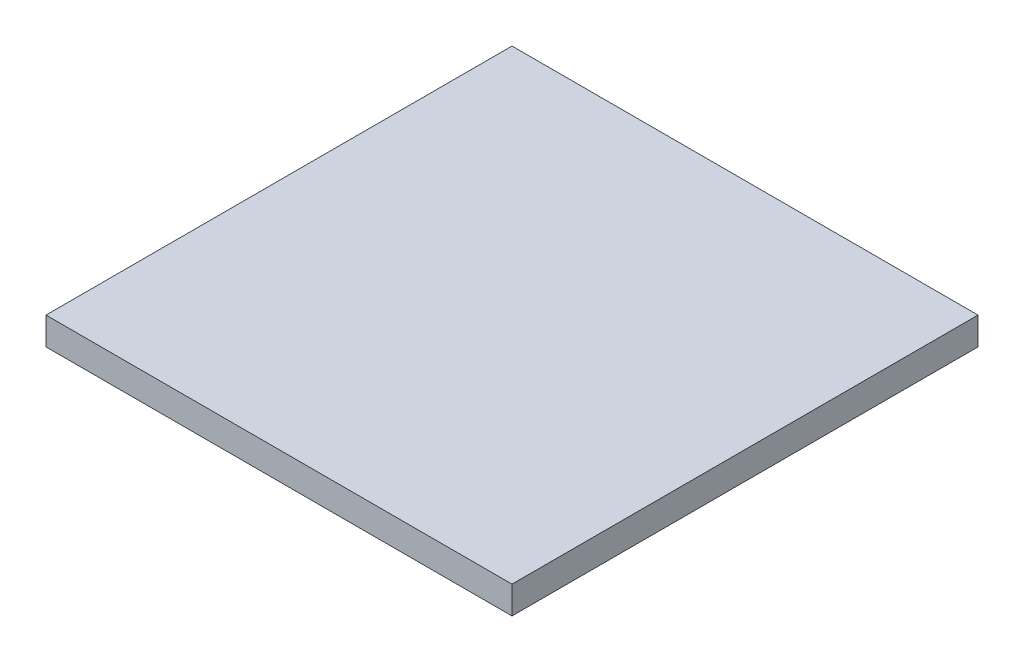
ISO-10303-21;
HEADER;
FILE_DESCRIPTION(('STEP AP214'),'2;1');
FILE_NAME('part.step','',(''),(''),'','','');
FILE_SCHEMA(('AUTOMOTIVE_DESIGN { 1 0 10303 214 1 1 1 1 }'));
ENDSEC;
DATA;
#1=APPLICATION_CONTEXT('core data for automotive mechanical design processes');
#2=APPLICATION_PROTOCOL_DEFINITION('international standard','automotive_design',2000,#1);
#3=PRODUCT_CONTEXT('',#1,'mechanical');
#4=PRODUCT('Part','Part','',(#3));
#5=PRODUCT_RELATED_PRODUCT_CATEGORY('part','',(#4));
#6=PRODUCT_DEFINITION_FORMATION('','',#4);
#7=PRODUCT_DEFINITION_CONTEXT('part definition',#1,'design');
#8=PRODUCT_DEFINITION('design','',#6,#7);
#9=PRODUCT_DEFINITION_SHAPE('','',#8);
#10=(LENGTH_UNIT() NAMED_UNIT(*) SI_UNIT(.MILLI.,.METRE.));
#11=(NAMED_UNIT(*) PLANE_ANGLE_UNIT() SI_UNIT($,.RADIAN.));
#12=(NAMED_UNIT(*) SI_UNIT($,.STERADIAN.) SOLID_ANGLE_UNIT());
#13=UNCERTAINTY_MEASURE_WITH_UNIT(LENGTH_MEASURE(1.E-05),#10,'distance_accuracy_value','');
#14=(GEOMETRIC_REPRESENTATION_CONTEXT(3) GLOBAL_UNCERTAINTY_ASSIGNED_CONTEXT((#13)) GLOBAL_UNIT_ASSIGNED_CONTEXT((#10,
#11,#12)) REPRESENTATION_CONTEXT('',''));
#15=CARTESIAN_POINT('',(0.,0.,0.));
#16=DIRECTION('',(0.,0.,1.));
#17=DIRECTION('',(1.,0.,0.));
#18=AXIS2_PLACEMENT_3D('',#15,#16,#17);
#19=CARTESIAN_POINT('',(812.8,48.1177599999999,1625.6));
#20=DIRECTION('',(-1.,0.,0.));
#21=DIRECTION('',(0.,0.,1.));
#22=AXIS2_PLACEMENT_3D('',#19,#20,#21);
#23=PLANE('',#22);
#24=DIRECTION('',(0.,1.,0.));
#25=VECTOR('',#24,1.);
#26=CARTESIAN_POINT('',(812.8,48.1177599999999,0.));
#27=LINE('',#26,#25);
#28=CARTESIAN_POINT('',(812.8,-48.1177599999999,0.));
#29=VERTEX_POINT('',#28);
#30=CARTESIAN_POINT('',(812.8,48.1177599999999,0.));
#31=VERTEX_POINT('',#30);
#32=EDGE_CURVE('E107',#29,#31,#27,.T.);
#33=ORIENTED_EDGE('',*,*,#32,.T.);
#34=DIRECTION('',(0.,0.,-1.));
#35=VECTOR('',#34,1.);
#36=CARTESIAN_POINT('',(812.8,48.1177599999999,1625.6));
#37=LINE('',#36,#35);
#38=CARTESIAN_POINT('',(812.8,48.1177599999999,1625.6));
#39=VERTEX_POINT('',#38);
#40=EDGE_CURVE('E11',#39,#31,#37,.T.);
#41=ORIENTED_EDGE('',*,*,#40,.F.);
#42=DIRECTION('',(0.,1.,0.));
#43=VECTOR('',#42,1.);
#44=CARTESIAN_POINT('',(812.8,48.1177599999999,1625.6));
#45=LINE('',#44,#43);
#46=CARTESIAN_POINT('',(812.8,-48.1177599999999,1625.6));
#47=VERTEX_POINT('',#46);
#48=EDGE_CURVE('E91',#47,#39,#45,.T.);
#49=ORIENTED_EDGE('',*,*,#48,.F.);
#50=DIRECTION('',(0.,0.,-1.));
#51=VECTOR('',#50,1.);
#52=CARTESIAN_POINT('',(812.8,-48.1177599999999,1625.6));
#53=LINE('',#52,#51);
#54=EDGE_CURVE('E103',#47,#29,#53,.T.);
#55=ORIENTED_EDGE('',*,*,#54,.T.);
#56=EDGE_LOOP('',(#33,#41,#49,#55));
#57=FACE_BOUND('',#56,.T.);
#58=ADVANCED_FACE('F39',(#57),#23,.F.);
#59=CARTESIAN_POINT('',(-812.8,48.1177599999999,1625.6));
#60=DIRECTION('',(0.,-1.,0.));
#61=DIRECTION('',(0.,0.,-1.));
#62=AXIS2_PLACEMENT_3D('',#59,#60,#61);
#63=PLANE('',#62);
#64=DIRECTION('',(-1.,0.,0.));
#65=VECTOR('',#64,1.);
#66=CARTESIAN_POINT('',(-812.8,48.1177599999999,0.));
#67=LINE('',#66,#65);
#68=CARTESIAN_POINT('',(-812.8,48.1177599999999,0.));
#69=VERTEX_POINT('',#68);
#70=EDGE_CURVE('E96',#31,#69,#67,.T.);
#71=ORIENTED_EDGE('',*,*,#70,.T.);
#72=DIRECTION('',(0.,0.,-1.));
#73=VECTOR('',#72,1.);
#74=CARTESIAN_POINT('',(-812.8,48.1177599999999,1625.6));
#75=LINE('',#74,#73);
#76=CARTESIAN_POINT('',(-812.8,48.1177599999999,1625.6));
#77=VERTEX_POINT('',#76);
#78=EDGE_CURVE('E48',#77,#69,#75,.T.);
#79=ORIENTED_EDGE('',*,*,#78,.F.);
#80=DIRECTION('',(-1.,0.,0.));
#81=VECTOR('',#80,1.);
#82=CARTESIAN_POINT('',(-812.8,48.1177599999999,1625.6));
#83=LINE('',#82,#81);
#84=EDGE_CURVE('E86',#39,#77,#83,.T.);
#85=ORIENTED_EDGE('',*,*,#84,.F.);
#86=ORIENTED_EDGE('',*,*,#40,.T.);
#87=EDGE_LOOP('',(#71,#79,#85,#86));
#88=FACE_BOUND('',#87,.T.);
#89=ADVANCED_FACE('F95',(#88),#63,.F.);
#90=CARTESIAN_POINT('',(-812.8,48.1177599999999,1625.6));
#91=DIRECTION('',(1.,0.,0.));
#92=DIRECTION('',(0.,0.,-1.));
#93=AXIS2_PLACEMENT_3D('',#90,#91,#92);
#94=PLANE('',#93);
#95=DIRECTION('',(0.,-1.,0.));
#96=VECTOR('',#95,1.);
#97=CARTESIAN_POINT('',(-812.8,48.1177599999999,0.));
#98=LINE('',#97,#96);
#99=CARTESIAN_POINT('',(-812.8,-48.1177599999999,0.));
#100=VERTEX_POINT('',#99);
#101=EDGE_CURVE('E73',#69,#100,#98,.T.);
#102=ORIENTED_EDGE('',*,*,#101,.T.);
#103=DIRECTION('',(0.,0.,-1.));
#104=VECTOR('',#103,1.);
#105=CARTESIAN_POINT('',(-812.8,-48.1177599999999,1625.6));
#106=LINE('',#105,#104);
#107=CARTESIAN_POINT('',(-812.8,-48.1177599999999,1625.6));
#108=VERTEX_POINT('',#107);
#109=EDGE_CURVE('E98',#108,#100,#106,.T.);
#110=ORIENTED_EDGE('',*,*,#109,.F.);
#111=DIRECTION('',(0.,-1.,0.));
#112=VECTOR('',#111,1.);
#113=CARTESIAN_POINT('',(-812.8,48.1177599999999,1625.6));
#114=LINE('',#113,#112);
#115=EDGE_CURVE('E89',#77,#108,#114,.T.);
#116=ORIENTED_EDGE('',*,*,#115,.F.);
#117=ORIENTED_EDGE('',*,*,#78,.T.);
#118=EDGE_LOOP('',(#102,#110,#116,#117));
#119=FACE_BOUND('',#118,.T.);
#120=ADVANCED_FACE('F99',(#119),#94,.F.);
#121=CARTESIAN_POINT('',(-812.8,-48.1177599999999,1625.6));
#122=DIRECTION('',(0.,1.,0.));
#123=DIRECTION('',(0.,0.,1.));
#124=AXIS2_PLACEMENT_3D('',#121,#122,#123);
#125=PLANE('',#124);
#126=DIRECTION('',(1.,0.,0.));
#127=VECTOR('',#126,1.);
#128=CARTESIAN_POINT('',(-812.8,-48.1177599999999,0.));
#129=LINE('',#128,#127);
#130=EDGE_CURVE('E79',#100,#29,#129,.T.);
#131=ORIENTED_EDGE('',*,*,#130,.T.);
#132=ORIENTED_EDGE('',*,*,#54,.F.);
#133=DIRECTION('',(1.,0.,0.));
#134=VECTOR('',#133,1.);
#135=CARTESIAN_POINT('',(-812.8,-48.1177599999999,1625.6));
#136=LINE('',#135,#134);
#137=EDGE_CURVE('E56',#108,#47,#136,.T.);
#138=ORIENTED_EDGE('',*,*,#137,.F.);
#139=ORIENTED_EDGE('',*,*,#109,.T.);
#140=EDGE_LOOP('',(#131,#132,#138,#139));
#141=FACE_BOUND('',#140,.T.);
#142=ADVANCED_FACE('F120',(#141),#125,.F.);
#143=CARTESIAN_POINT('',(0.,0.,1625.6));
#144=DIRECTION('',(0.,0.,1.));
#145=DIRECTION('',(1.,0.,0.));
#146=AXIS2_PLACEMENT_3D('',#143,#144,#145);
#147=PLANE('',#146);
#148=ORIENTED_EDGE('',*,*,#48,.T.);
#149=ORIENTED_EDGE('',*,*,#84,.T.);
#150=ORIENTED_EDGE('',*,*,#115,.T.);
#151=ORIENTED_EDGE('',*,*,#137,.T.);
#152=EDGE_LOOP('',(#148,#149,#150,#151));
#153=FACE_BOUND('',#152,.T.);
#154=ADVANCED_FACE('F87',(#153),#147,.T.);
#155=CARTESIAN_POINT('',(0.,0.,0.));
#156=DIRECTION('',(0.,0.,1.));
#157=DIRECTION('',(1.,0.,0.));
#158=AXIS2_PLACEMENT_3D('',#155,#156,#157);
#159=PLANE('',#158);
#160=ORIENTED_EDGE('',*,*,#32,.F.);
#161=ORIENTED_EDGE('',*,*,#130,.F.);
#162=ORIENTED_EDGE('',*,*,#101,.F.);
#163=ORIENTED_EDGE('',*,*,#70,.F.);
#164=EDGE_LOOP('',(#160,#161,#162,#163));
#165=FACE_BOUND('',#164,.T.);
#166=ADVANCED_FACE('F123',(#165),#159,.F.);
#167=CLOSED_SHELL('',(#58,#89,#120,#142,#154,#166));
#168=MANIFOLD_SOLID_BREP('B2',#167);
#169=ADVANCED_BREP_SHAPE_REPRESENTATION('',(#18,#168),#14);
#170=SHAPE_DEFINITION_REPRESENTATION(#9,#169);
ENDSEC;
END-ISO-10303-21;
